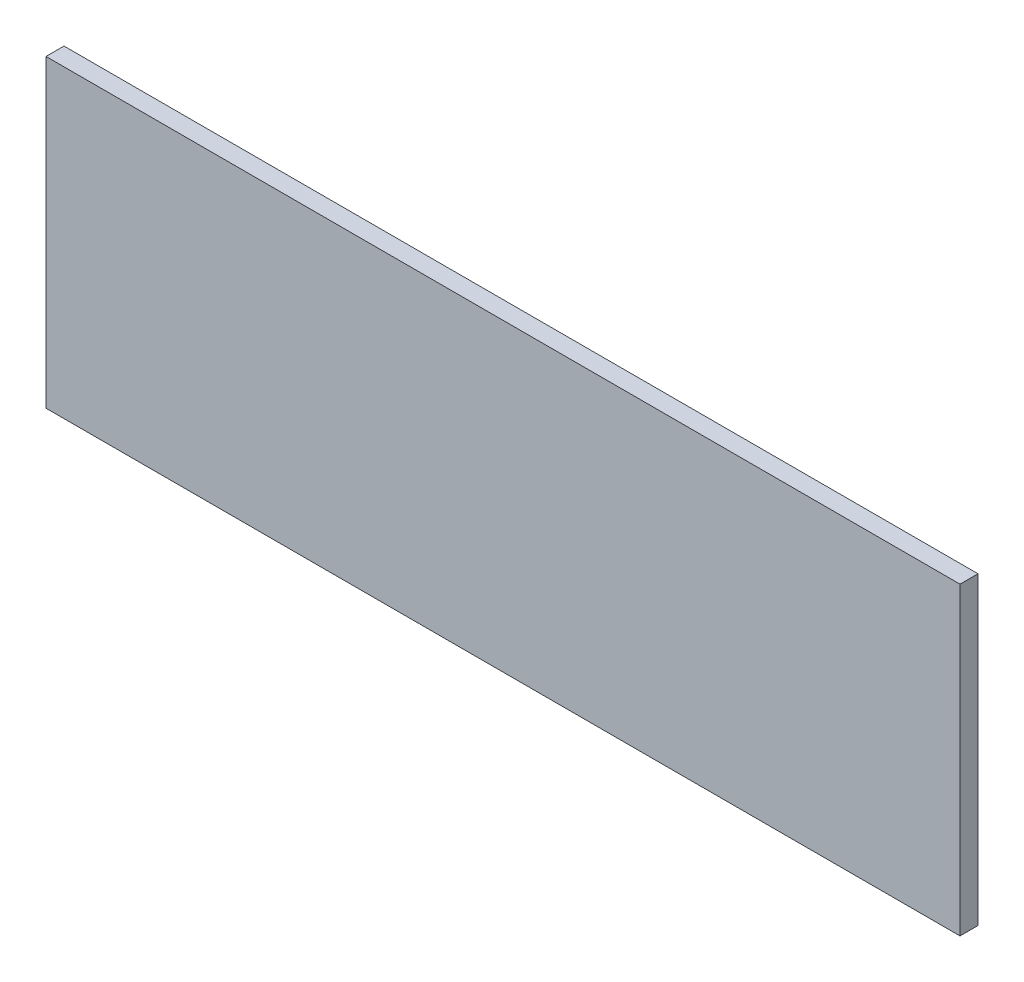
ISO-10303-21;
HEADER;
FILE_DESCRIPTION(('STEP AP214'),'2;1');
FILE_NAME('part.step','',(''),(''),'','','');
FILE_SCHEMA(('AUTOMOTIVE_DESIGN { 1 0 10303 214 1 1 1 1 }'));
ENDSEC;
DATA;
#1=APPLICATION_CONTEXT('core data for automotive mechanical design processes');
#2=APPLICATION_PROTOCOL_DEFINITION('international standard','automotive_design',2000,#1);
#3=PRODUCT_CONTEXT('',#1,'mechanical');
#4=PRODUCT('Part','Part','',(#3));
#5=PRODUCT_RELATED_PRODUCT_CATEGORY('part','',(#4));
#6=PRODUCT_DEFINITION_FORMATION('','',#4);
#7=PRODUCT_DEFINITION_CONTEXT('part definition',#1,'design');
#8=PRODUCT_DEFINITION('design','',#6,#7);
#9=PRODUCT_DEFINITION_SHAPE('','',#8);
#10=(LENGTH_UNIT() NAMED_UNIT(*) SI_UNIT(.MILLI.,.METRE.));
#11=(NAMED_UNIT(*) PLANE_ANGLE_UNIT() SI_UNIT($,.RADIAN.));
#12=(NAMED_UNIT(*) SI_UNIT($,.STERADIAN.) SOLID_ANGLE_UNIT());
#13=UNCERTAINTY_MEASURE_WITH_UNIT(LENGTH_MEASURE(1.E-05),#10,'distance_accuracy_value','');
#14=(GEOMETRIC_REPRESENTATION_CONTEXT(3) GLOBAL_UNCERTAINTY_ASSIGNED_CONTEXT((#13)) GLOBAL_UNIT_ASSIGNED_CONTEXT((#10,
#11,#12)) REPRESENTATION_CONTEXT('',''));
#15=CARTESIAN_POINT('',(0.,0.,0.));
#16=DIRECTION('',(0.,0.,1.));
#17=DIRECTION('',(1.,0.,0.));
#18=AXIS2_PLACEMENT_3D('',#15,#16,#17);
#19=CARTESIAN_POINT('',(-66.8786362471161,17.605873219321,1.5));
#20=DIRECTION('',(1.,0.,0.));
#21=DIRECTION('',(0.,0.,-1.));
#22=AXIS2_PLACEMENT_3D('',#19,#20,#21);
#23=PLANE('',#22);
#24=DIRECTION('',(0.,-1.,0.));
#25=VECTOR('',#24,1.);
#26=CARTESIAN_POINT('',(-66.8786362471161,17.605873219321,0.));
#27=LINE('',#26,#25);
#28=CARTESIAN_POINT('',(-66.8786362471161,17.605873219321,0.));
#29=VERTEX_POINT('',#28);
#30=CARTESIAN_POINT('',(-66.8786362471161,-7.79412678067895,0.));
#31=VERTEX_POINT('',#30);
#32=EDGE_CURVE('E86',#29,#31,#27,.T.);
#33=ORIENTED_EDGE('',*,*,#32,.T.);
#34=DIRECTION('',(0.,0.,-1.));
#35=VECTOR('',#34,1.);
#36=CARTESIAN_POINT('',(-66.8786362471161,-7.79412678067895,1.5));
#37=LINE('',#36,#35);
#38=CARTESIAN_POINT('',(-66.8786362471161,-7.79412678067895,1.5));
#39=VERTEX_POINT('',#38);
#40=EDGE_CURVE('E11',#39,#31,#37,.T.);
#41=ORIENTED_EDGE('',*,*,#40,.F.);
#42=DIRECTION('',(0.,-1.,0.));
#43=VECTOR('',#42,1.);
#44=CARTESIAN_POINT('',(-66.8786362471161,17.605873219321,1.5));
#45=LINE('',#44,#43);
#46=CARTESIAN_POINT('',(-66.8786362471161,17.605873219321,1.5));
#47=VERTEX_POINT('',#46);
#48=EDGE_CURVE('E68',#47,#39,#45,.T.);
#49=ORIENTED_EDGE('',*,*,#48,.F.);
#50=DIRECTION('',(0.,0.,-1.));
#51=VECTOR('',#50,1.);
#52=CARTESIAN_POINT('',(-66.8786362471161,17.605873219321,1.5));
#53=LINE('',#52,#51);
#54=EDGE_CURVE('E82',#47,#29,#53,.T.);
#55=ORIENTED_EDGE('',*,*,#54,.T.);
#56=EDGE_LOOP('',(#33,#41,#49,#55));
#57=FACE_BOUND('',#56,.T.);
#58=ADVANCED_FACE('F16',(#57),#23,.F.);
#59=CARTESIAN_POINT('',(-66.8786362471161,-7.79412678067895,1.5));
#60=DIRECTION('',(0.,1.,0.));
#61=DIRECTION('',(0.,0.,1.));
#62=AXIS2_PLACEMENT_3D('',#59,#60,#61);
#63=PLANE('',#62);
#64=DIRECTION('',(1.,0.,0.));
#65=VECTOR('',#64,1.);
#66=CARTESIAN_POINT('',(-66.8786362471161,-7.79412678067895,0.));
#67=LINE('',#66,#65);
#68=CARTESIAN_POINT('',(9.32136375288388,-7.79412678067895,0.));
#69=VERTEX_POINT('',#68);
#70=EDGE_CURVE('E73',#31,#69,#67,.T.);
#71=ORIENTED_EDGE('',*,*,#70,.T.);
#72=DIRECTION('',(0.,0.,-1.));
#73=VECTOR('',#72,1.);
#74=CARTESIAN_POINT('',(9.32136375288388,-7.79412678067895,1.5));
#75=LINE('',#74,#73);
#76=CARTESIAN_POINT('',(9.32136375288388,-7.79412678067895,1.5));
#77=VERTEX_POINT('',#76);
#78=EDGE_CURVE('E25',#77,#69,#75,.T.);
#79=ORIENTED_EDGE('',*,*,#78,.F.);
#80=DIRECTION('',(1.,0.,0.));
#81=VECTOR('',#80,1.);
#82=CARTESIAN_POINT('',(-66.8786362471161,-7.79412678067895,1.5));
#83=LINE('',#82,#81);
#84=EDGE_CURVE('E63',#39,#77,#83,.T.);
#85=ORIENTED_EDGE('',*,*,#84,.F.);
#86=ORIENTED_EDGE('',*,*,#40,.T.);
#87=EDGE_LOOP('',(#71,#79,#85,#86));
#88=FACE_BOUND('',#87,.T.);
#89=ADVANCED_FACE('F72',(#88),#63,.F.);
#90=CARTESIAN_POINT('',(9.32136375288387,17.605873219321,1.5));
#91=DIRECTION('',(-1.,0.,0.));
#92=DIRECTION('',(0.,-1.,0.));
#93=AXIS2_PLACEMENT_3D('',#90,#91,#92);
#94=PLANE('',#93);
#95=DIRECTION('',(0.,1.,0.));
#96=VECTOR('',#95,1.);
#97=CARTESIAN_POINT('',(9.32136375288387,17.605873219321,0.));
#98=LINE('',#97,#96);
#99=CARTESIAN_POINT('',(9.32136375288387,17.605873219321,0.));
#100=VERTEX_POINT('',#99);
#101=EDGE_CURVE('E50',#69,#100,#98,.T.);
#102=ORIENTED_EDGE('',*,*,#101,.T.);
#103=DIRECTION('',(0.,0.,-1.));
#104=VECTOR('',#103,1.);
#105=CARTESIAN_POINT('',(9.32136375288387,17.605873219321,1.5));
#106=LINE('',#105,#104);
#107=CARTESIAN_POINT('',(9.32136375288387,17.605873219321,1.5));
#108=VERTEX_POINT('',#107);
#109=EDGE_CURVE('E75',#108,#100,#106,.T.);
#110=ORIENTED_EDGE('',*,*,#109,.F.);
#111=DIRECTION('',(0.,1.,0.));
#112=VECTOR('',#111,1.);
#113=CARTESIAN_POINT('',(9.32136375288387,17.605873219321,1.5));
#114=LINE('',#113,#112);
#115=EDGE_CURVE('E66',#77,#108,#114,.T.);
#116=ORIENTED_EDGE('',*,*,#115,.F.);
#117=ORIENTED_EDGE('',*,*,#78,.T.);
#118=EDGE_LOOP('',(#102,#110,#116,#117));
#119=FACE_BOUND('',#118,.T.);
#120=ADVANCED_FACE('F76',(#119),#94,.F.);
#121=CARTESIAN_POINT('',(-66.8786362471161,17.605873219321,1.5));
#122=DIRECTION('',(0.,-1.,0.));
#123=DIRECTION('',(0.,0.,-1.));
#124=AXIS2_PLACEMENT_3D('',#121,#122,#123);
#125=PLANE('',#124);
#126=DIRECTION('',(-1.,0.,0.));
#127=VECTOR('',#126,1.);
#128=CARTESIAN_POINT('',(-66.8786362471161,17.605873219321,0.));
#129=LINE('',#128,#127);
#130=EDGE_CURVE('E56',#100,#29,#129,.T.);
#131=ORIENTED_EDGE('',*,*,#130,.T.);
#132=ORIENTED_EDGE('',*,*,#54,.F.);
#133=DIRECTION('',(-1.,0.,0.));
#134=VECTOR('',#133,1.);
#135=CARTESIAN_POINT('',(-66.8786362471161,17.605873219321,1.5));
#136=LINE('',#135,#134);
#137=EDGE_CURVE('E33',#108,#47,#136,.T.);
#138=ORIENTED_EDGE('',*,*,#137,.F.);
#139=ORIENTED_EDGE('',*,*,#109,.T.);
#140=EDGE_LOOP('',(#131,#132,#138,#139));
#141=FACE_BOUND('',#140,.T.);
#142=ADVANCED_FACE('F100',(#141),#125,.F.);
#143=CARTESIAN_POINT('',(0.,0.,1.5));
#144=DIRECTION('',(0.,0.,1.));
#145=DIRECTION('',(1.,0.,0.));
#146=AXIS2_PLACEMENT_3D('',#143,#144,#145);
#147=PLANE('',#146);
#148=ORIENTED_EDGE('',*,*,#48,.T.);
#149=ORIENTED_EDGE('',*,*,#84,.T.);
#150=ORIENTED_EDGE('',*,*,#115,.T.);
#151=ORIENTED_EDGE('',*,*,#137,.T.);
#152=EDGE_LOOP('',(#148,#149,#150,#151));
#153=FACE_BOUND('',#152,.T.);
#154=ADVANCED_FACE('F64',(#153),#147,.T.);
#155=CARTESIAN_POINT('',(0.,0.,0.));
#156=DIRECTION('',(0.,0.,1.));
#157=DIRECTION('',(1.,0.,0.));
#158=AXIS2_PLACEMENT_3D('',#155,#156,#157);
#159=PLANE('',#158);
#160=ORIENTED_EDGE('',*,*,#32,.F.);
#161=ORIENTED_EDGE('',*,*,#130,.F.);
#162=ORIENTED_EDGE('',*,*,#101,.F.);
#163=ORIENTED_EDGE('',*,*,#70,.F.);
#164=EDGE_LOOP('',(#160,#161,#162,#163));
#165=FACE_BOUND('',#164,.T.);
#166=ADVANCED_FACE('F103',(#165),#159,.F.);
#167=CLOSED_SHELL('',(#58,#89,#120,#142,#154,#166));
#168=MANIFOLD_SOLID_BREP('B1',#167);
#169=ADVANCED_BREP_SHAPE_REPRESENTATION('',(#18,#168),#14);
#170=SHAPE_DEFINITION_REPRESENTATION(#9,#169);
ENDSEC;
END-ISO-10303-21;
